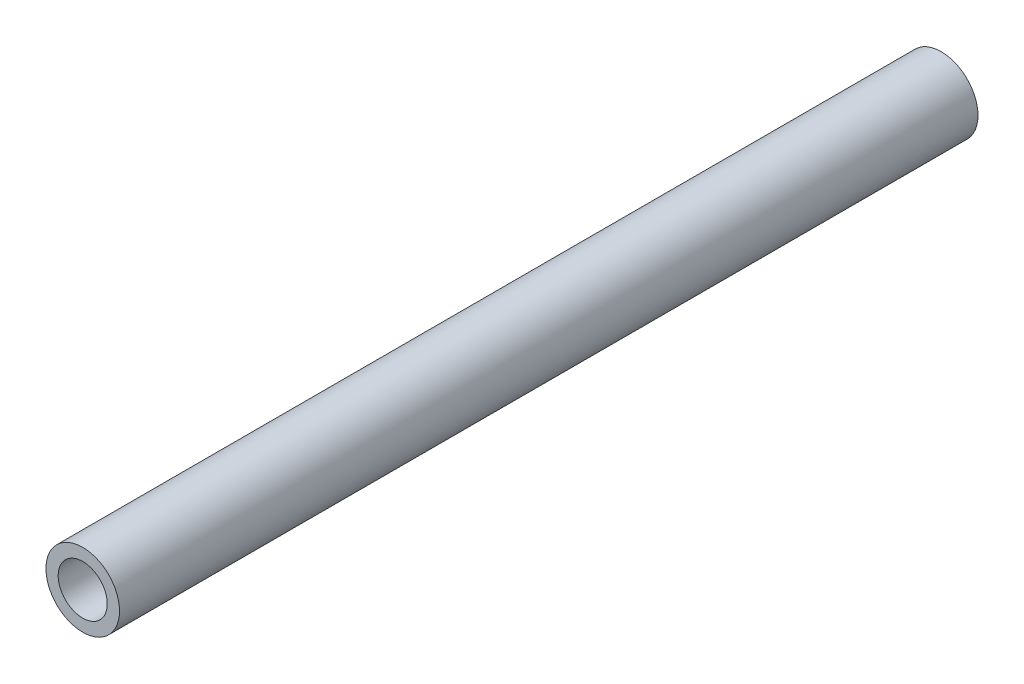
ISO-10303-21;
HEADER;
FILE_DESCRIPTION(('STEP AP214'),'2;1');
FILE_NAME('part.step','',(''),(''),'','','');
FILE_SCHEMA(('AUTOMOTIVE_DESIGN { 1 0 10303 214 1 1 1 1 }'));
ENDSEC;
DATA;
#1=APPLICATION_CONTEXT('core data for automotive mechanical design processes');
#2=APPLICATION_PROTOCOL_DEFINITION('international standard','automotive_design',2000,#1);
#3=PRODUCT_CONTEXT('',#1,'mechanical');
#4=PRODUCT('Part','Part','',(#3));
#5=PRODUCT_RELATED_PRODUCT_CATEGORY('part','',(#4));
#6=PRODUCT_DEFINITION_FORMATION('','',#4);
#7=PRODUCT_DEFINITION_CONTEXT('part definition',#1,'design');
#8=PRODUCT_DEFINITION('design','',#6,#7);
#9=PRODUCT_DEFINITION_SHAPE('','',#8);
#10=(LENGTH_UNIT() NAMED_UNIT(*) SI_UNIT(.MILLI.,.METRE.));
#11=(NAMED_UNIT(*) PLANE_ANGLE_UNIT() SI_UNIT($,.RADIAN.));
#12=(NAMED_UNIT(*) SI_UNIT($,.STERADIAN.) SOLID_ANGLE_UNIT());
#13=UNCERTAINTY_MEASURE_WITH_UNIT(LENGTH_MEASURE(1.E-05),#10,'distance_accuracy_value','');
#14=(GEOMETRIC_REPRESENTATION_CONTEXT(3) GLOBAL_UNCERTAINTY_ASSIGNED_CONTEXT((#13)) GLOBAL_UNIT_ASSIGNED_CONTEXT((#10,
#11,#12)) REPRESENTATION_CONTEXT('',''));
#15=CARTESIAN_POINT('',(0.,0.,0.));
#16=DIRECTION('',(0.,0.,1.));
#17=DIRECTION('',(1.,0.,0.));
#18=AXIS2_PLACEMENT_3D('',#15,#16,#17);
#19=CARTESIAN_POINT('',(-0.992203805522902,0.0115180334406377,35.));
#20=DIRECTION('',(0.,0.,1.));
#21=DIRECTION('',(1.,0.,0.));
#22=AXIS2_PLACEMENT_3D('',#19,#20,#21);
#23=PLANE('',#22);
#24=CARTESIAN_POINT('',(-0.992203805522902,0.0115180334406377,35.));
#25=DIRECTION('',(0.,0.,1.));
#26=DIRECTION('',(1.,0.,0.));
#27=AXIS2_PLACEMENT_3D('',#24,#25,#26);
#28=CIRCLE('',#27,1.5);
#29=CARTESIAN_POINT('',(0.507796194477098,0.0115180334406377,35.));
#30=VERTEX_POINT('',#29);
#31=EDGE_CURVE('E10',#30,#30,#28,.T.);
#32=ORIENTED_EDGE('',*,*,#31,.T.);
#33=EDGE_LOOP('',(#32));
#34=FACE_BOUND('',#33,.T.);
#35=CARTESIAN_POINT('',(-0.992203805522902,0.0115180334406377,35.));
#36=DIRECTION('',(0.,0.,1.));
#37=DIRECTION('',(1.,0.,0.));
#38=AXIS2_PLACEMENT_3D('',#35,#36,#37);
#39=CIRCLE('',#38,1.);
#40=CARTESIAN_POINT('',(0.00779619447709764,0.0115180334406377,35.));
#41=VERTEX_POINT('',#40);
#42=EDGE_CURVE('E47',#41,#41,#39,.T.);
#43=ORIENTED_EDGE('',*,*,#42,.F.);
#44=EDGE_LOOP('',(#43));
#45=FACE_BOUND('',#44,.T.);
#46=ADVANCED_FACE('F36',(#34,#45),#23,.T.);
#47=CARTESIAN_POINT('',(-0.992203805522902,0.0115180334406377,0.));
#48=DIRECTION('',(0.,0.,1.));
#49=DIRECTION('',(1.,0.,0.));
#50=AXIS2_PLACEMENT_3D('',#47,#48,#49);
#51=PLANE('',#50);
#52=CARTESIAN_POINT('',(-0.992203805522902,0.0115180334406377,0.));
#53=DIRECTION('',(0.,0.,1.));
#54=DIRECTION('',(1.,0.,0.));
#55=AXIS2_PLACEMENT_3D('',#52,#53,#54);
#56=CIRCLE('',#55,1.5);
#57=CARTESIAN_POINT('',(0.507796194477098,0.0115180334406377,0.));
#58=VERTEX_POINT('',#57);
#59=EDGE_CURVE('E40',#58,#58,#56,.T.);
#60=ORIENTED_EDGE('',*,*,#59,.F.);
#61=EDGE_LOOP('',(#60));
#62=FACE_BOUND('',#61,.T.);
#63=CARTESIAN_POINT('',(-0.992203805522902,0.0115180334406377,0.));
#64=DIRECTION('',(0.,0.,1.));
#65=DIRECTION('',(1.,0.,0.));
#66=AXIS2_PLACEMENT_3D('',#63,#64,#65);
#67=CIRCLE('',#66,1.);
#68=CARTESIAN_POINT('',(0.00779619447709764,0.0115180334406377,0.));
#69=VERTEX_POINT('',#68);
#70=EDGE_CURVE('E49',#69,#69,#67,.T.);
#71=ORIENTED_EDGE('',*,*,#70,.T.);
#72=EDGE_LOOP('',(#71));
#73=FACE_BOUND('',#72,.T.);
#74=ADVANCED_FACE('F59',(#62,#73),#51,.F.);
#75=CARTESIAN_POINT('',(-0.992203805522902,0.0115180334406377,35.));
#76=DIRECTION('',(0.,0.,-1.));
#77=DIRECTION('',(-1.,0.,0.));
#78=AXIS2_PLACEMENT_3D('',#75,#76,#77);
#79=CYLINDRICAL_SURFACE('',#78,1.5);
#80=ORIENTED_EDGE('',*,*,#31,.F.);
#81=EDGE_LOOP('',(#80));
#82=FACE_BOUND('',#81,.T.);
#83=ORIENTED_EDGE('',*,*,#59,.T.);
#84=EDGE_LOOP('',(#83));
#85=FACE_BOUND('',#84,.T.);
#86=ADVANCED_FACE('F38',(#82,#85),#79,.T.);
#87=CARTESIAN_POINT('',(-0.992203805522902,0.0115180334406377,35.));
#88=DIRECTION('',(0.,0.,-1.));
#89=DIRECTION('',(-1.,0.,0.));
#90=AXIS2_PLACEMENT_3D('',#87,#88,#89);
#91=CYLINDRICAL_SURFACE('',#90,1.);
#92=ORIENTED_EDGE('',*,*,#42,.T.);
#93=EDGE_LOOP('',(#92));
#94=FACE_BOUND('',#93,.T.);
#95=ORIENTED_EDGE('',*,*,#70,.F.);
#96=EDGE_LOOP('',(#95));
#97=FACE_BOUND('',#96,.T.);
#98=ADVANCED_FACE('F55',(#94,#97),#91,.F.);
#99=CLOSED_SHELL('',(#46,#74,#86,#98));
#100=MANIFOLD_SOLID_BREP('B2',#99);
#101=ADVANCED_BREP_SHAPE_REPRESENTATION('',(#18,#100),#14);
#102=SHAPE_DEFINITION_REPRESENTATION(#9,#101);
ENDSEC;
END-ISO-10303-21;
